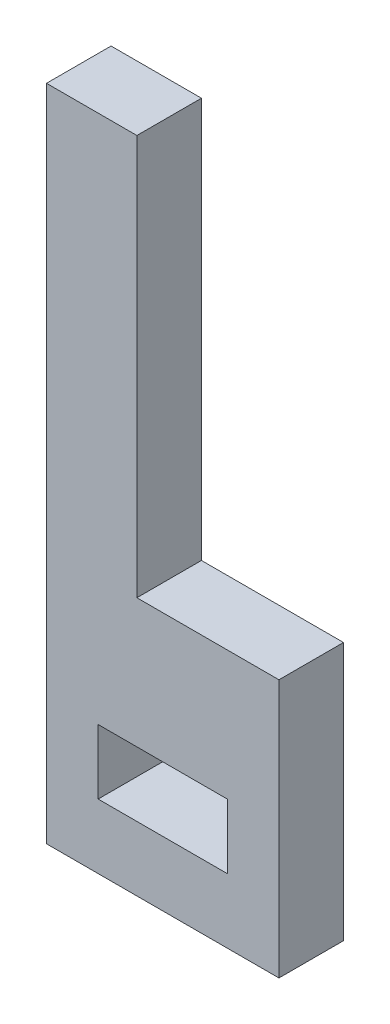
ISO-10303-21;
HEADER;
FILE_DESCRIPTION(('STEP AP214'),'2;1');
FILE_NAME('part.step','',(''),(''),'','','');
FILE_SCHEMA(('AUTOMOTIVE_DESIGN { 1 0 10303 214 1 1 1 1 }'));
ENDSEC;
DATA;
#1=APPLICATION_CONTEXT('core data for automotive mechanical design processes');
#2=APPLICATION_PROTOCOL_DEFINITION('international standard','automotive_design',2000,#1);
#3=PRODUCT_CONTEXT('',#1,'mechanical');
#4=PRODUCT('Part','Part','',(#3));
#5=PRODUCT_RELATED_PRODUCT_CATEGORY('part','',(#4));
#6=PRODUCT_DEFINITION_FORMATION('','',#4);
#7=PRODUCT_DEFINITION_CONTEXT('part definition',#1,'design');
#8=PRODUCT_DEFINITION('design','',#6,#7);
#9=PRODUCT_DEFINITION_SHAPE('','',#8);
#10=(LENGTH_UNIT() NAMED_UNIT(*) SI_UNIT(.MILLI.,.METRE.));
#11=(NAMED_UNIT(*) PLANE_ANGLE_UNIT() SI_UNIT($,.RADIAN.));
#12=(NAMED_UNIT(*) SI_UNIT($,.STERADIAN.) SOLID_ANGLE_UNIT());
#13=UNCERTAINTY_MEASURE_WITH_UNIT(LENGTH_MEASURE(1.E-05),#10,'distance_accuracy_value','');
#14=(GEOMETRIC_REPRESENTATION_CONTEXT(3) GLOBAL_UNCERTAINTY_ASSIGNED_CONTEXT((#13)) GLOBAL_UNIT_ASSIGNED_CONTEXT((#10,
#11,#12)) REPRESENTATION_CONTEXT('',''));
#15=CARTESIAN_POINT('',(0.,0.,0.));
#16=DIRECTION('',(0.,0.,1.));
#17=DIRECTION('',(1.,0.,0.));
#18=AXIS2_PLACEMENT_3D('',#15,#16,#17);
#19=CARTESIAN_POINT('',(18.,0.,5.));
#20=DIRECTION('',(0.,1.,0.));
#21=DIRECTION('',(-1.,0.,0.));
#22=AXIS2_PLACEMENT_3D('',#19,#20,#21);
#23=PLANE('',#22);
#24=DIRECTION('',(1.,0.,0.));
#25=VECTOR('',#24,1.);
#26=CARTESIAN_POINT('',(18.,0.,0.));
#27=LINE('',#26,#25);
#28=CARTESIAN_POINT('',(0.,0.,0.));
#29=VERTEX_POINT('',#28);
#30=CARTESIAN_POINT('',(18.,0.,0.));
#31=VERTEX_POINT('',#30);
#32=EDGE_CURVE('E158',#29,#31,#27,.T.);
#33=ORIENTED_EDGE('',*,*,#32,.T.);
#34=DIRECTION('',(0.,0.,-1.));
#35=VECTOR('',#34,1.);
#36=CARTESIAN_POINT('',(18.,0.,5.));
#37=LINE('',#36,#35);
#38=CARTESIAN_POINT('',(18.,0.,5.));
#39=VERTEX_POINT('',#38);
#40=EDGE_CURVE('E11',#39,#31,#37,.T.);
#41=ORIENTED_EDGE('',*,*,#40,.F.);
#42=DIRECTION('',(1.,0.,0.));
#43=VECTOR('',#42,1.);
#44=CARTESIAN_POINT('',(18.,0.,5.));
#45=LINE('',#44,#43);
#46=CARTESIAN_POINT('',(0.,0.,5.));
#47=VERTEX_POINT('',#46);
#48=EDGE_CURVE('E164',#47,#39,#45,.T.);
#49=ORIENTED_EDGE('',*,*,#48,.F.);
#50=DIRECTION('',(0.,0.,-1.));
#51=VECTOR('',#50,1.);
#52=CARTESIAN_POINT('',(0.,0.,5.));
#53=LINE('',#52,#51);
#54=EDGE_CURVE('E184',#47,#29,#53,.T.);
#55=ORIENTED_EDGE('',*,*,#54,.T.);
#56=EDGE_LOOP('',(#33,#41,#49,#55));
#57=FACE_BOUND('',#56,.T.);
#58=ADVANCED_FACE('F39',(#57),#23,.F.);
#59=CARTESIAN_POINT('',(18.,20.,5.));
#60=DIRECTION('',(-1.,0.,0.));
#61=DIRECTION('',(0.,-1.,0.));
#62=AXIS2_PLACEMENT_3D('',#59,#60,#61);
#63=PLANE('',#62);
#64=DIRECTION('',(0.,1.,0.));
#65=VECTOR('',#64,1.);
#66=CARTESIAN_POINT('',(18.,20.,0.));
#67=LINE('',#66,#65);
#68=CARTESIAN_POINT('',(18.,20.,0.));
#69=VERTEX_POINT('',#68);
#70=EDGE_CURVE('E188',#31,#69,#67,.T.);
#71=ORIENTED_EDGE('',*,*,#70,.T.);
#72=DIRECTION('',(0.,0.,-1.));
#73=VECTOR('',#72,1.);
#74=CARTESIAN_POINT('',(18.,20.,5.));
#75=LINE('',#74,#73);
#76=CARTESIAN_POINT('',(18.,20.,5.));
#77=VERTEX_POINT('',#76);
#78=EDGE_CURVE('E47',#77,#69,#75,.T.);
#79=ORIENTED_EDGE('',*,*,#78,.F.);
#80=DIRECTION('',(0.,1.,0.));
#81=VECTOR('',#80,1.);
#82=CARTESIAN_POINT('',(18.,20.,5.));
#83=LINE('',#82,#81);
#84=EDGE_CURVE('E168',#39,#77,#83,.T.);
#85=ORIENTED_EDGE('',*,*,#84,.F.);
#86=ORIENTED_EDGE('',*,*,#40,.T.);
#87=EDGE_LOOP('',(#71,#79,#85,#86));
#88=FACE_BOUND('',#87,.T.);
#89=ADVANCED_FACE('F243',(#88),#63,.F.);
#90=CARTESIAN_POINT('',(7.,20.,5.));
#91=DIRECTION('',(0.,-1.,0.));
#92=DIRECTION('',(0.,0.,-1.));
#93=AXIS2_PLACEMENT_3D('',#90,#91,#92);
#94=PLANE('',#93);
#95=DIRECTION('',(-1.,0.,0.));
#96=VECTOR('',#95,1.);
#97=CARTESIAN_POINT('',(7.,20.,0.));
#98=LINE('',#97,#96);
#99=CARTESIAN_POINT('',(7.,20.,0.));
#100=VERTEX_POINT('',#99);
#101=EDGE_CURVE('E191',#69,#100,#98,.T.);
#102=ORIENTED_EDGE('',*,*,#101,.T.);
#103=DIRECTION('',(0.,0.,-1.));
#104=VECTOR('',#103,1.);
#105=CARTESIAN_POINT('',(7.,20.,5.));
#106=LINE('',#105,#104);
#107=CARTESIAN_POINT('',(7.,20.,5.));
#108=VERTEX_POINT('',#107);
#109=EDGE_CURVE('E213',#108,#100,#106,.T.);
#110=ORIENTED_EDGE('',*,*,#109,.F.);
#111=DIRECTION('',(-1.,0.,0.));
#112=VECTOR('',#111,1.);
#113=CARTESIAN_POINT('',(7.,20.,5.));
#114=LINE('',#113,#112);
#115=EDGE_CURVE('E172',#77,#108,#114,.T.);
#116=ORIENTED_EDGE('',*,*,#115,.F.);
#117=ORIENTED_EDGE('',*,*,#78,.T.);
#118=EDGE_LOOP('',(#102,#110,#116,#117));
#119=FACE_BOUND('',#118,.T.);
#120=ADVANCED_FACE('F222',(#119),#94,.F.);
#121=CARTESIAN_POINT('',(7.,51.,5.));
#122=DIRECTION('',(-1.,0.,0.));
#123=DIRECTION('',(0.,-1.,0.));
#124=AXIS2_PLACEMENT_3D('',#121,#122,#123);
#125=PLANE('',#124);
#126=DIRECTION('',(0.,1.,0.));
#127=VECTOR('',#126,1.);
#128=CARTESIAN_POINT('',(7.,51.,0.));
#129=LINE('',#128,#127);
#130=CARTESIAN_POINT('',(7.,51.,0.));
#131=VERTEX_POINT('',#130);
#132=EDGE_CURVE('E194',#100,#131,#129,.T.);
#133=ORIENTED_EDGE('',*,*,#132,.T.);
#134=DIRECTION('',(0.,0.,-1.));
#135=VECTOR('',#134,1.);
#136=CARTESIAN_POINT('',(7.,51.,5.));
#137=LINE('',#136,#135);
#138=CARTESIAN_POINT('',(7.,51.,5.));
#139=VERTEX_POINT('',#138);
#140=EDGE_CURVE('E209',#139,#131,#137,.T.);
#141=ORIENTED_EDGE('',*,*,#140,.F.);
#142=DIRECTION('',(0.,1.,0.));
#143=VECTOR('',#142,1.);
#144=CARTESIAN_POINT('',(7.,51.,5.));
#145=LINE('',#144,#143);
#146=EDGE_CURVE('E175',#108,#139,#145,.T.);
#147=ORIENTED_EDGE('',*,*,#146,.F.);
#148=ORIENTED_EDGE('',*,*,#109,.T.);
#149=EDGE_LOOP('',(#133,#141,#147,#148));
#150=FACE_BOUND('',#149,.T.);
#151=ADVANCED_FACE('F231',(#150),#125,.F.);
#152=CARTESIAN_POINT('',(0.,51.,5.));
#153=DIRECTION('',(0.,-1.,0.));
#154=DIRECTION('',(0.,0.,-1.));
#155=AXIS2_PLACEMENT_3D('',#152,#153,#154);
#156=PLANE('',#155);
#157=DIRECTION('',(-1.,0.,0.));
#158=VECTOR('',#157,1.);
#159=CARTESIAN_POINT('',(0.,51.,0.));
#160=LINE('',#159,#158);
#161=CARTESIAN_POINT('',(0.,51.,0.));
#162=VERTEX_POINT('',#161);
#163=EDGE_CURVE('E197',#131,#162,#160,.T.);
#164=ORIENTED_EDGE('',*,*,#163,.T.);
#165=DIRECTION('',(0.,0.,-1.));
#166=VECTOR('',#165,1.);
#167=CARTESIAN_POINT('',(0.,51.,5.));
#168=LINE('',#167,#166);
#169=CARTESIAN_POINT('',(0.,51.,5.));
#170=VERTEX_POINT('',#169);
#171=EDGE_CURVE('E205',#170,#162,#168,.T.);
#172=ORIENTED_EDGE('',*,*,#171,.F.);
#173=DIRECTION('',(-1.,0.,0.));
#174=VECTOR('',#173,1.);
#175=CARTESIAN_POINT('',(0.,51.,5.));
#176=LINE('',#175,#174);
#177=EDGE_CURVE('E178',#139,#170,#176,.T.);
#178=ORIENTED_EDGE('',*,*,#177,.F.);
#179=ORIENTED_EDGE('',*,*,#140,.T.);
#180=EDGE_LOOP('',(#164,#172,#178,#179));
#181=FACE_BOUND('',#180,.T.);
#182=ADVANCED_FACE('F235',(#181),#156,.F.);
#183=CARTESIAN_POINT('',(0.,0.,5.));
#184=DIRECTION('',(1.,0.,0.));
#185=DIRECTION('',(0.,0.,-1.));
#186=AXIS2_PLACEMENT_3D('',#183,#184,#185);
#187=PLANE('',#186);
#188=DIRECTION('',(0.,-1.,0.));
#189=VECTOR('',#188,1.);
#190=CARTESIAN_POINT('',(0.,0.,0.));
#191=LINE('',#190,#189);
#192=EDGE_CURVE('E169',#162,#29,#191,.T.);
#193=ORIENTED_EDGE('',*,*,#192,.T.);
#194=ORIENTED_EDGE('',*,*,#54,.F.);
#195=DIRECTION('',(0.,-1.,0.));
#196=VECTOR('',#195,1.);
#197=CARTESIAN_POINT('',(0.,0.,5.));
#198=LINE('',#197,#196);
#199=EDGE_CURVE('E181',#170,#47,#198,.T.);
#200=ORIENTED_EDGE('',*,*,#199,.F.);
#201=ORIENTED_EDGE('',*,*,#171,.T.);
#202=EDGE_LOOP('',(#193,#194,#200,#201));
#203=FACE_BOUND('',#202,.T.);
#204=ADVANCED_FACE('F246',(#203),#187,.F.);
#205=CARTESIAN_POINT('',(0.,0.,5.));
#206=DIRECTION('',(0.,0.,-1.));
#207=DIRECTION('',(-1.,0.,0.));
#208=AXIS2_PLACEMENT_3D('',#205,#206,#207);
#209=PLANE('',#208);
#210=DIRECTION('',(0.,-1.,0.));
#211=VECTOR('',#210,1.);
#212=CARTESIAN_POINT('',(14.,10.,5.));
#213=LINE('',#212,#211);
#214=CARTESIAN_POINT('',(14.,10.,5.));
#215=VERTEX_POINT('',#214);
#216=CARTESIAN_POINT('',(14.,5.,5.));
#217=VERTEX_POINT('',#216);
#218=EDGE_CURVE('E149',#215,#217,#213,.T.);
#219=ORIENTED_EDGE('',*,*,#218,.T.);
#220=DIRECTION('',(1.,0.,0.));
#221=VECTOR('',#220,1.);
#222=CARTESIAN_POINT('',(4.,5.,5.));
#223=LINE('',#222,#221);
#224=CARTESIAN_POINT('',(4.,5.,5.));
#225=VERTEX_POINT('',#224);
#226=EDGE_CURVE('E54',#225,#217,#223,.T.);
#227=ORIENTED_EDGE('',*,*,#226,.F.);
#228=DIRECTION('',(0.,-1.,0.));
#229=VECTOR('',#228,1.);
#230=CARTESIAN_POINT('',(4.,10.,5.));
#231=LINE('',#230,#229);
#232=CARTESIAN_POINT('',(4.,10.,5.));
#233=VERTEX_POINT('',#232);
#234=EDGE_CURVE('E136',#233,#225,#231,.T.);
#235=ORIENTED_EDGE('',*,*,#234,.F.);
#236=DIRECTION('',(1.,0.,0.));
#237=VECTOR('',#236,1.);
#238=CARTESIAN_POINT('',(4.,10.,5.));
#239=LINE('',#238,#237);
#240=EDGE_CURVE('E140',#233,#215,#239,.T.);
#241=ORIENTED_EDGE('',*,*,#240,.T.);
#242=EDGE_LOOP('',(#219,#227,#235,#241));
#243=FACE_BOUND('',#242,.T.);
#244=ORIENTED_EDGE('',*,*,#48,.T.);
#245=ORIENTED_EDGE('',*,*,#84,.T.);
#246=ORIENTED_EDGE('',*,*,#115,.T.);
#247=ORIENTED_EDGE('',*,*,#146,.T.);
#248=ORIENTED_EDGE('',*,*,#177,.T.);
#249=ORIENTED_EDGE('',*,*,#199,.T.);
#250=EDGE_LOOP('',(#244,#245,#246,#247,#248,#249));
#251=FACE_BOUND('',#250,.T.);
#252=ADVANCED_FACE('F239',(#243,#251),#209,.F.);
#253=CARTESIAN_POINT('',(0.,0.,0.));
#254=DIRECTION('',(0.,0.,-1.));
#255=DIRECTION('',(-1.,0.,0.));
#256=AXIS2_PLACEMENT_3D('',#253,#254,#255);
#257=PLANE('',#256);
#258=DIRECTION('',(1.,0.,0.));
#259=VECTOR('',#258,1.);
#260=CARTESIAN_POINT('',(4.,5.,0.));
#261=LINE('',#260,#259);
#262=CARTESIAN_POINT('',(4.,5.,0.));
#263=VERTEX_POINT('',#262);
#264=CARTESIAN_POINT('',(14.,5.,0.));
#265=VERTEX_POINT('',#264);
#266=EDGE_CURVE('E124',#263,#265,#261,.T.);
#267=ORIENTED_EDGE('',*,*,#266,.T.);
#268=DIRECTION('',(0.,-1.,0.));
#269=VECTOR('',#268,1.);
#270=CARTESIAN_POINT('',(14.,10.,0.));
#271=LINE('',#270,#269);
#272=CARTESIAN_POINT('',(14.,10.,0.));
#273=VERTEX_POINT('',#272);
#274=EDGE_CURVE('E115',#273,#265,#271,.T.);
#275=ORIENTED_EDGE('',*,*,#274,.F.);
#276=DIRECTION('',(1.,0.,0.));
#277=VECTOR('',#276,1.);
#278=CARTESIAN_POINT('',(4.,10.,0.));
#279=LINE('',#278,#277);
#280=CARTESIAN_POINT('',(4.,10.,0.));
#281=VERTEX_POINT('',#280);
#282=EDGE_CURVE('E123',#281,#273,#279,.T.);
#283=ORIENTED_EDGE('',*,*,#282,.F.);
#284=DIRECTION('',(0.,-1.,0.));
#285=VECTOR('',#284,1.);
#286=CARTESIAN_POINT('',(4.,10.,0.));
#287=LINE('',#286,#285);
#288=EDGE_CURVE('E130',#281,#263,#287,.T.);
#289=ORIENTED_EDGE('',*,*,#288,.T.);
#290=EDGE_LOOP('',(#267,#275,#283,#289));
#291=FACE_BOUND('',#290,.T.);
#292=ORIENTED_EDGE('',*,*,#32,.F.);
#293=ORIENTED_EDGE('',*,*,#192,.F.);
#294=ORIENTED_EDGE('',*,*,#163,.F.);
#295=ORIENTED_EDGE('',*,*,#132,.F.);
#296=ORIENTED_EDGE('',*,*,#101,.F.);
#297=ORIENTED_EDGE('',*,*,#70,.F.);
#298=EDGE_LOOP('',(#292,#293,#294,#295,#296,#297));
#299=FACE_BOUND('',#298,.T.);
#300=ADVANCED_FACE('F132',(#291,#299),#257,.T.);
#301=CARTESIAN_POINT('',(4.,5.,0.));
#302=DIRECTION('',(0.,-1.,0.));
#303=DIRECTION('',(0.,0.,-1.));
#304=AXIS2_PLACEMENT_3D('',#301,#302,#303);
#305=PLANE('',#304);
#306=ORIENTED_EDGE('',*,*,#226,.T.);
#307=DIRECTION('',(0.,0.,1.));
#308=VECTOR('',#307,1.);
#309=CARTESIAN_POINT('',(14.,5.,0.));
#310=LINE('',#309,#308);
#311=EDGE_CURVE('E117',#265,#217,#310,.T.);
#312=ORIENTED_EDGE('',*,*,#311,.F.);
#313=ORIENTED_EDGE('',*,*,#266,.F.);
#314=DIRECTION('',(0.,0.,1.));
#315=VECTOR('',#314,1.);
#316=CARTESIAN_POINT('',(4.,5.,0.));
#317=LINE('',#316,#315);
#318=EDGE_CURVE('E155',#263,#225,#317,.T.);
#319=ORIENTED_EDGE('',*,*,#318,.T.);
#320=EDGE_LOOP('',(#306,#312,#313,#319));
#321=FACE_BOUND('',#320,.T.);
#322=ADVANCED_FACE('F127',(#321),#305,.F.);
#323=CARTESIAN_POINT('',(4.,10.,0.));
#324=DIRECTION('',(-1.,0.,0.));
#325=DIRECTION('',(0.,-1.,0.));
#326=AXIS2_PLACEMENT_3D('',#323,#324,#325);
#327=PLANE('',#326);
#328=ORIENTED_EDGE('',*,*,#234,.T.);
#329=ORIENTED_EDGE('',*,*,#318,.F.);
#330=ORIENTED_EDGE('',*,*,#288,.F.);
#331=DIRECTION('',(0.,0.,1.));
#332=VECTOR('',#331,1.);
#333=CARTESIAN_POINT('',(4.,10.,0.));
#334=LINE('',#333,#332);
#335=EDGE_CURVE('E159',#281,#233,#334,.T.);
#336=ORIENTED_EDGE('',*,*,#335,.T.);
#337=EDGE_LOOP('',(#328,#329,#330,#336));
#338=FACE_BOUND('',#337,.T.);
#339=ADVANCED_FACE('F301',(#338),#327,.F.);
#340=CARTESIAN_POINT('',(4.,10.,0.));
#341=DIRECTION('',(0.,-1.,0.));
#342=DIRECTION('',(1.,0.,0.));
#343=AXIS2_PLACEMENT_3D('',#340,#341,#342);
#344=PLANE('',#343);
#345=ORIENTED_EDGE('',*,*,#240,.F.);
#346=ORIENTED_EDGE('',*,*,#335,.F.);
#347=ORIENTED_EDGE('',*,*,#282,.T.);
#348=DIRECTION('',(0.,0.,1.));
#349=VECTOR('',#348,1.);
#350=CARTESIAN_POINT('',(14.,10.,0.));
#351=LINE('',#350,#349);
#352=EDGE_CURVE('E62',#273,#215,#351,.T.);
#353=ORIENTED_EDGE('',*,*,#352,.T.);
#354=EDGE_LOOP('',(#345,#346,#347,#353));
#355=FACE_BOUND('',#354,.T.);
#356=ADVANCED_FACE('F310',(#355),#344,.T.);
#357=CARTESIAN_POINT('',(14.,10.,0.));
#358=DIRECTION('',(-1.,0.,0.));
#359=DIRECTION('',(0.,-1.,0.));
#360=AXIS2_PLACEMENT_3D('',#357,#358,#359);
#361=PLANE('',#360);
#362=ORIENTED_EDGE('',*,*,#218,.F.);
#363=ORIENTED_EDGE('',*,*,#352,.F.);
#364=ORIENTED_EDGE('',*,*,#274,.T.);
#365=ORIENTED_EDGE('',*,*,#311,.T.);
#366=EDGE_LOOP('',(#362,#363,#364,#365));
#367=FACE_BOUND('',#366,.T.);
#368=ADVANCED_FACE('F116',(#367),#361,.T.);
#369=CLOSED_SHELL('',(#58,#89,#120,#151,#182,#204,#252,#300,#322,#339,#356,#368));
#370=MANIFOLD_SOLID_BREP('B2',#369);
#371=ADVANCED_BREP_SHAPE_REPRESENTATION('',(#18,#370),#14);
#372=SHAPE_DEFINITION_REPRESENTATION(#9,#371);
ENDSEC;
END-ISO-10303-21;
